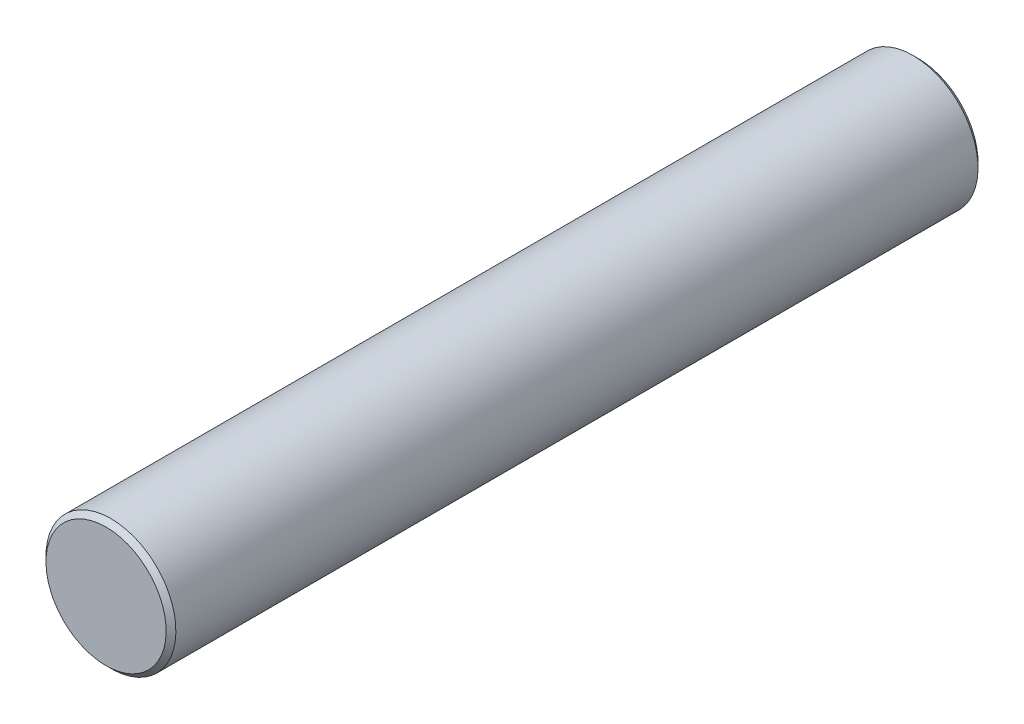
ISO-10303-21;
HEADER;
FILE_DESCRIPTION(('STEP AP214'),'2;1');
FILE_NAME('part.step','',(''),(''),'','','');
FILE_SCHEMA(('AUTOMOTIVE_DESIGN { 1 0 10303 214 1 1 1 1 }'));
ENDSEC;
DATA;
#1=APPLICATION_CONTEXT('core data for automotive mechanical design processes');
#2=APPLICATION_PROTOCOL_DEFINITION('international standard','automotive_design',2000,#1);
#3=PRODUCT_CONTEXT('',#1,'mechanical');
#4=PRODUCT('Part','Part','',(#3));
#5=PRODUCT_RELATED_PRODUCT_CATEGORY('part','',(#4));
#6=PRODUCT_DEFINITION_FORMATION('','',#4);
#7=PRODUCT_DEFINITION_CONTEXT('part definition',#1,'design');
#8=PRODUCT_DEFINITION('design','',#6,#7);
#9=PRODUCT_DEFINITION_SHAPE('','',#8);
#10=(LENGTH_UNIT() NAMED_UNIT(*) SI_UNIT(.MILLI.,.METRE.));
#11=(NAMED_UNIT(*) PLANE_ANGLE_UNIT() SI_UNIT($,.RADIAN.));
#12=(NAMED_UNIT(*) SI_UNIT($,.STERADIAN.) SOLID_ANGLE_UNIT());
#13=UNCERTAINTY_MEASURE_WITH_UNIT(LENGTH_MEASURE(1.E-05),#10,'distance_accuracy_value','');
#14=(GEOMETRIC_REPRESENTATION_CONTEXT(3) GLOBAL_UNCERTAINTY_ASSIGNED_CONTEXT((#13)) GLOBAL_UNIT_ASSIGNED_CONTEXT((#10,
#11,#12)) REPRESENTATION_CONTEXT('',''));
#15=CARTESIAN_POINT('',(0.,0.,0.));
#16=DIRECTION('',(0.,0.,1.));
#17=DIRECTION('',(1.,0.,0.));
#18=AXIS2_PLACEMENT_3D('',#15,#16,#17);
#19=CARTESIAN_POINT('',(0.,9.25,0.));
#20=DIRECTION('',(0.,0.,-1.));
#21=DIRECTION('',(0.,1.,0.));
#22=AXIS2_PLACEMENT_3D('',#19,#20,#21);
#23=PLANE('',#22);
#24=CARTESIAN_POINT('',(0.,0.,0.));
#25=DIRECTION('',(0.,0.,-1.));
#26=DIRECTION('',(0.,1.,0.));
#27=AXIS2_PLACEMENT_3D('',#24,#25,#26);
#28=CIRCLE('',#27,18.5);
#29=CARTESIAN_POINT('',(0.,18.5,0.));
#30=VERTEX_POINT('',#29);
#31=EDGE_CURVE('E9',#30,#30,#28,.T.);
#32=ORIENTED_EDGE('',*,*,#31,.T.);
#33=EDGE_LOOP('',(#32));
#34=FACE_BOUND('',#33,.T.);
#35=CARTESIAN_POINT('',(0.,0.,0.));
#36=DIRECTION('',(0.,0.,1.));
#37=DIRECTION('',(-1.,0.,0.));
#38=AXIS2_PLACEMENT_3D('',#35,#36,#37);
#39=CIRCLE('',#38,6.);
#40=CARTESIAN_POINT('',(-6.,0.,0.));
#41=VERTEX_POINT('',#40);
#42=EDGE_CURVE('E52',#41,#41,#39,.T.);
#43=ORIENTED_EDGE('',*,*,#42,.T.);
#44=EDGE_LOOP('',(#43));
#45=FACE_BOUND('',#44,.T.);
#46=ADVANCED_FACE('F15',(#34,#45),#23,.T.);
#47=CARTESIAN_POINT('',(0.,0.,0.75));
#48=DIRECTION('',(0.,0.,1.));
#49=DIRECTION('',(0.,1.,0.));
#50=AXIS2_PLACEMENT_3D('',#47,#48,#49);
#51=CONICAL_SURFACE('',#50,19.25,0.785398163397448);
#52=CARTESIAN_POINT('',(0.,0.,1.5));
#53=DIRECTION('',(0.,0.,-1.));
#54=DIRECTION('',(0.,1.,0.));
#55=AXIS2_PLACEMENT_3D('',#52,#53,#54);
#56=CIRCLE('',#55,20.);
#57=CARTESIAN_POINT('',(0.,20.,1.5));
#58=VERTEX_POINT('',#57);
#59=EDGE_CURVE('E25',#58,#58,#56,.T.);
#60=ORIENTED_EDGE('',*,*,#59,.T.);
#61=EDGE_LOOP('',(#60));
#62=FACE_BOUND('',#61,.T.);
#63=ORIENTED_EDGE('',*,*,#31,.F.);
#64=EDGE_LOOP('',(#63));
#65=FACE_BOUND('',#64,.T.);
#66=ADVANCED_FACE('F121',(#62,#65),#51,.T.);
#67=CARTESIAN_POINT('',(0.,0.,125.));
#68=DIRECTION('',(0.,0.,1.));
#69=DIRECTION('',(0.,1.,0.));
#70=AXIS2_PLACEMENT_3D('',#67,#68,#69);
#71=CYLINDRICAL_SURFACE('',#70,20.);
#72=CARTESIAN_POINT('',(0.,0.,248.5));
#73=DIRECTION('',(0.,0.,-1.));
#74=DIRECTION('',(0.,1.,0.));
#75=AXIS2_PLACEMENT_3D('',#72,#73,#74);
#76=CIRCLE('',#75,20.);
#77=CARTESIAN_POINT('',(0.,20.,248.5));
#78=VERTEX_POINT('',#77);
#79=EDGE_CURVE('E19',#78,#78,#76,.T.);
#80=ORIENTED_EDGE('',*,*,#79,.T.);
#81=EDGE_LOOP('',(#80));
#82=FACE_BOUND('',#81,.T.);
#83=ORIENTED_EDGE('',*,*,#59,.F.);
#84=EDGE_LOOP('',(#83));
#85=FACE_BOUND('',#84,.T.);
#86=CARTESIAN_POINT('',(0.,0.,6.5));
#87=DIRECTION('',(0.,0.,-1.));
#88=DIRECTION('',(0.,1.,0.));
#89=AXIS2_PLACEMENT_3D('',#86,#87,#88);
#90=CIRCLE('',#89,20.);
#91=CARTESIAN_POINT('',(10.5356537528527,-17.,6.5));
#92=VERTEX_POINT('',#91);
#93=CARTESIAN_POINT('',(-10.5356537528527,-17.,6.5));
#94=VERTEX_POINT('',#93);
#95=EDGE_CURVE('E69',#92,#94,#90,.T.);
#96=ORIENTED_EDGE('',*,*,#95,.T.);
#97=DIRECTION('',(0.,0.,1.));
#98=VECTOR('',#97,1.);
#99=CARTESIAN_POINT('',(-10.5356537528527,-17.,8.25));
#100=LINE('',#99,#98);
#101=CARTESIAN_POINT('',(-10.5356537528527,-17.,10.));
#102=VERTEX_POINT('',#101);
#103=EDGE_CURVE('E62',#94,#102,#100,.T.);
#104=ORIENTED_EDGE('',*,*,#103,.T.);
#105=CARTESIAN_POINT('',(0.,0.,10.));
#106=DIRECTION('',(0.,0.,1.));
#107=DIRECTION('',(0.,1.,0.));
#108=AXIS2_PLACEMENT_3D('',#105,#106,#107);
#109=CIRCLE('',#108,20.);
#110=CARTESIAN_POINT('',(10.5356537528527,-17.,10.));
#111=VERTEX_POINT('',#110);
#112=EDGE_CURVE('E75',#102,#111,#109,.T.);
#113=ORIENTED_EDGE('',*,*,#112,.T.);
#114=DIRECTION('',(0.,0.,-1.));
#115=VECTOR('',#114,1.);
#116=CARTESIAN_POINT('',(10.5356537528527,-17.,8.25));
#117=LINE('',#116,#115);
#118=EDGE_CURVE('E60',#111,#92,#117,.T.);
#119=ORIENTED_EDGE('',*,*,#118,.T.);
#120=EDGE_LOOP('',(#96,#104,#113,#119));
#121=FACE_BOUND('',#120,.T.);
#122=ADVANCED_FACE('F17',(#82,#85,#121),#71,.T.);
#123=CARTESIAN_POINT('',(0.,0.,249.25));
#124=DIRECTION('',(0.,0.,-1.));
#125=DIRECTION('',(0.,1.,0.));
#126=AXIS2_PLACEMENT_3D('',#123,#124,#125);
#127=CONICAL_SURFACE('',#126,19.25,0.785398163397448);
#128=CARTESIAN_POINT('',(0.,0.,250.));
#129=DIRECTION('',(0.,0.,-1.));
#130=DIRECTION('',(0.,1.,0.));
#131=AXIS2_PLACEMENT_3D('',#128,#129,#130);
#132=CIRCLE('',#131,18.5);
#133=CARTESIAN_POINT('',(0.,18.5,250.));
#134=VERTEX_POINT('',#133);
#135=EDGE_CURVE('E44',#134,#134,#132,.T.);
#136=ORIENTED_EDGE('',*,*,#135,.T.);
#137=EDGE_LOOP('',(#136));
#138=FACE_BOUND('',#137,.T.);
#139=ORIENTED_EDGE('',*,*,#79,.F.);
#140=EDGE_LOOP('',(#139));
#141=FACE_BOUND('',#140,.T.);
#142=ADVANCED_FACE('F116',(#138,#141),#127,.T.);
#143=CARTESIAN_POINT('',(0.,9.25,250.));
#144=DIRECTION('',(0.,0.,1.));
#145=DIRECTION('',(0.,-1.,0.));
#146=AXIS2_PLACEMENT_3D('',#143,#144,#145);
#147=PLANE('',#146);
#148=ORIENTED_EDGE('',*,*,#135,.F.);
#149=EDGE_LOOP('',(#148));
#150=FACE_BOUND('',#149,.T.);
#151=ADVANCED_FACE('F110',(#150),#147,.T.);
#152=CARTESIAN_POINT('',(0.,0.,26.4586213285198));
#153=DIRECTION('',(0.,0.,-1.));
#154=DIRECTION('',(-1.,0.,0.));
#155=AXIS2_PLACEMENT_3D('',#152,#153,#154);
#156=CONICAL_SURFACE('',#155,2.52640625,1.0471975511966);
#157=CARTESIAN_POINT('',(0.,0.,25.));
#158=DIRECTION('',(0.,0.,1.));
#159=DIRECTION('',(-1.,0.,0.));
#160=AXIS2_PLACEMENT_3D('',#157,#158,#159);
#161=CIRCLE('',#160,5.0528125);
#162=CARTESIAN_POINT('',(-5.0528125,0.,25.));
#163=VERTEX_POINT('',#162);
#164=EDGE_CURVE('E51',#163,#163,#161,.T.);
#165=ORIENTED_EDGE('',*,*,#164,.F.);
#166=EDGE_LOOP('',(#165));
#167=FACE_BOUND('',#166,.T.);
#168=CARTESIAN_POINT('',(0.,0.,27.9172426570397));
#169=VERTEX_POINT('',#168);
#170=VERTEX_LOOP('',#169);
#171=FACE_BOUND('',#170,.T.);
#172=ADVANCED_FACE('F104',(#167,#171),#156,.F.);
#173=CARTESIAN_POINT('',(0.,0.,12.97359375));
#174=DIRECTION('',(0.,0.,-1.));
#175=DIRECTION('',(-1.,0.,0.));
#176=AXIS2_PLACEMENT_3D('',#173,#174,#175);
#177=CYLINDRICAL_SURFACE('',#176,5.0528125);
#178=CARTESIAN_POINT('',(0.,0.,0.9471875));
#179=DIRECTION('',(0.,0.,1.));
#180=DIRECTION('',(-1.,0.,0.));
#181=AXIS2_PLACEMENT_3D('',#178,#179,#180);
#182=CIRCLE('',#181,5.0528125);
#183=CARTESIAN_POINT('',(-5.0528125,0.,0.9471875));
#184=VERTEX_POINT('',#183);
#185=EDGE_CURVE('E57',#184,#184,#182,.T.);
#186=ORIENTED_EDGE('',*,*,#185,.F.);
#187=EDGE_LOOP('',(#186));
#188=FACE_BOUND('',#187,.T.);
#189=ORIENTED_EDGE('',*,*,#164,.T.);
#190=EDGE_LOOP('',(#189));
#191=FACE_BOUND('',#190,.T.);
#192=ADVANCED_FACE('F101',(#188,#191),#177,.F.);
#193=CARTESIAN_POINT('',(0.,0.,0.47359375));
#194=DIRECTION('',(0.,0.,-1.));
#195=DIRECTION('',(-1.,0.,0.));
#196=AXIS2_PLACEMENT_3D('',#193,#194,#195);
#197=CONICAL_SURFACE('',#196,5.52640625,0.785398163397448);
#198=ORIENTED_EDGE('',*,*,#42,.F.);
#199=EDGE_LOOP('',(#198));
#200=FACE_BOUND('',#199,.T.);
#201=ORIENTED_EDGE('',*,*,#185,.T.);
#202=EDGE_LOOP('',(#201));
#203=FACE_BOUND('',#202,.T.);
#204=ADVANCED_FACE('F99',(#200,#203),#197,.F.);
#205=CARTESIAN_POINT('',(0.,-17.,8.25));
#206=DIRECTION('',(0.,-1.,0.));
#207=DIRECTION('',(0.,0.,-1.));
#208=AXIS2_PLACEMENT_3D('',#205,#206,#207);
#209=PLANE('',#208);
#210=ORIENTED_EDGE('',*,*,#103,.F.);
#211=DIRECTION('',(1.,0.,0.));
#212=VECTOR('',#211,1.);
#213=CARTESIAN_POINT('',(0.,-17.,6.5));
#214=LINE('',#213,#212);
#215=EDGE_CURVE('E66',#94,#92,#214,.T.);
#216=ORIENTED_EDGE('',*,*,#215,.T.);
#217=ORIENTED_EDGE('',*,*,#118,.F.);
#218=DIRECTION('',(-1.,0.,0.));
#219=VECTOR('',#218,1.);
#220=CARTESIAN_POINT('',(0.,-17.,10.));
#221=LINE('',#220,#219);
#222=EDGE_CURVE('E72',#111,#102,#221,.T.);
#223=ORIENTED_EDGE('',*,*,#222,.T.);
#224=EDGE_LOOP('',(#210,#216,#217,#223));
#225=FACE_BOUND('',#224,.T.);
#226=ADVANCED_FACE('F131',(#225),#209,.T.);
#227=CARTESIAN_POINT('',(0.,-19.5,6.5));
#228=DIRECTION('',(0.,0.,1.));
#229=DIRECTION('',(1.,0.,0.));
#230=AXIS2_PLACEMENT_3D('',#227,#228,#229);
#231=PLANE('',#230);
#232=ORIENTED_EDGE('',*,*,#95,.F.);
#233=ORIENTED_EDGE('',*,*,#215,.F.);
#234=EDGE_LOOP('',(#232,#233));
#235=FACE_BOUND('',#234,.T.);
#236=ADVANCED_FACE('F135',(#235),#231,.T.);
#237=CARTESIAN_POINT('',(0.,-19.5,10.));
#238=DIRECTION('',(0.,0.,1.));
#239=DIRECTION('',(1.,0.,0.));
#240=AXIS2_PLACEMENT_3D('',#237,#238,#239);
#241=PLANE('',#240);
#242=ORIENTED_EDGE('',*,*,#112,.F.);
#243=ORIENTED_EDGE('',*,*,#222,.F.);
#244=EDGE_LOOP('',(#242,#243));
#245=FACE_BOUND('',#244,.T.);
#246=ADVANCED_FACE('F87',(#245),#241,.F.);
#247=CLOSED_SHELL('',(#46,#66,#122,#142,#151,#172,#192,#204,#226,#236,#246));
#248=MANIFOLD_SOLID_BREP('B1',#247);
#249=ADVANCED_BREP_SHAPE_REPRESENTATION('',(#18,#248),#14);
#250=SHAPE_DEFINITION_REPRESENTATION(#9,#249);
ENDSEC;
END-ISO-10303-21;
